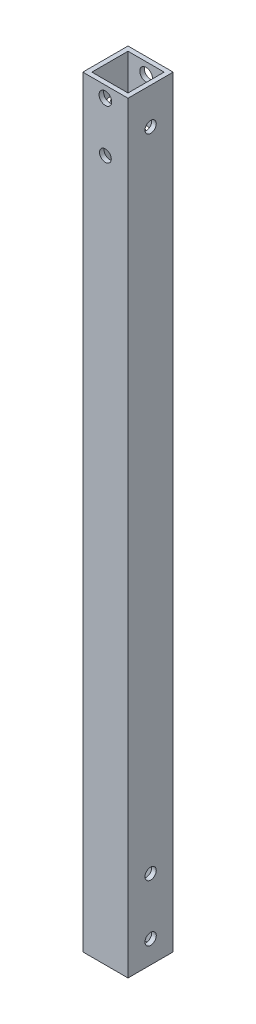
ISO-10303-21;
HEADER;
FILE_DESCRIPTION(('STEP AP214'),'2;1');
FILE_NAME('part.step','',(''),(''),'','','');
FILE_SCHEMA(('AUTOMOTIVE_DESIGN { 1 0 10303 214 1 1 1 1 }'));
ENDSEC;
DATA;
#1=APPLICATION_CONTEXT('core data for automotive mechanical design processes');
#2=APPLICATION_PROTOCOL_DEFINITION('international standard','automotive_design',2000,#1);
#3=PRODUCT_CONTEXT('',#1,'mechanical');
#4=PRODUCT('Part','Part','',(#3));
#5=PRODUCT_RELATED_PRODUCT_CATEGORY('part','',(#4));
#6=PRODUCT_DEFINITION_FORMATION('','',#4);
#7=PRODUCT_DEFINITION_CONTEXT('part definition',#1,'design');
#8=PRODUCT_DEFINITION('design','',#6,#7);
#9=PRODUCT_DEFINITION_SHAPE('','',#8);
#10=(LENGTH_UNIT() NAMED_UNIT(*) SI_UNIT(.MILLI.,.METRE.));
#11=(NAMED_UNIT(*) PLANE_ANGLE_UNIT() SI_UNIT($,.RADIAN.));
#12=(NAMED_UNIT(*) SI_UNIT($,.STERADIAN.) SOLID_ANGLE_UNIT());
#13=UNCERTAINTY_MEASURE_WITH_UNIT(LENGTH_MEASURE(1.E-05),#10,'distance_accuracy_value','');
#14=(GEOMETRIC_REPRESENTATION_CONTEXT(3) GLOBAL_UNCERTAINTY_ASSIGNED_CONTEXT((#13)) GLOBAL_UNIT_ASSIGNED_CONTEXT((#10,
#11,#12)) REPRESENTATION_CONTEXT('',''));
#15=CARTESIAN_POINT('',(0.,0.,0.));
#16=DIRECTION('',(0.,0.,1.));
#17=DIRECTION('',(1.,0.,0.));
#18=AXIS2_PLACEMENT_3D('',#15,#16,#17);
#19=CARTESIAN_POINT('',(0.,337.,0.));
#20=DIRECTION('',(0.,1.,0.));
#21=DIRECTION('',(0.,0.,1.));
#22=AXIS2_PLACEMENT_3D('',#19,#20,#21);
#23=PLANE('',#22);
#24=DIRECTION('',(0.,0.,1.));
#25=VECTOR('',#24,1.);
#26=CARTESIAN_POINT('',(0.,337.,0.));
#27=LINE('',#26,#25);
#28=CARTESIAN_POINT('',(0.,337.,-20.));
#29=VERTEX_POINT('',#28);
#30=CARTESIAN_POINT('',(0.,337.,0.));
#31=VERTEX_POINT('',#30);
#32=EDGE_CURVE('E164',#29,#31,#27,.T.);
#33=ORIENTED_EDGE('',*,*,#32,.T.);
#34=DIRECTION('',(1.,0.,0.));
#35=VECTOR('',#34,1.);
#36=CARTESIAN_POINT('',(0.,337.,0.));
#37=LINE('',#36,#35);
#38=CARTESIAN_POINT('',(20.,337.,0.));
#39=VERTEX_POINT('',#38);
#40=EDGE_CURVE('E167',#31,#39,#37,.T.);
#41=ORIENTED_EDGE('',*,*,#40,.T.);
#42=DIRECTION('',(0.,0.,-1.));
#43=VECTOR('',#42,1.);
#44=CARTESIAN_POINT('',(20.,337.,0.));
#45=LINE('',#44,#43);
#46=CARTESIAN_POINT('',(20.,337.,-20.));
#47=VERTEX_POINT('',#46);
#48=EDGE_CURVE('E170',#39,#47,#45,.T.);
#49=ORIENTED_EDGE('',*,*,#48,.T.);
#50=DIRECTION('',(-1.,0.,0.));
#51=VECTOR('',#50,1.);
#52=CARTESIAN_POINT('',(0.,337.,-20.));
#53=LINE('',#52,#51);
#54=EDGE_CURVE('E172',#47,#29,#53,.T.);
#55=ORIENTED_EDGE('',*,*,#54,.T.);
#56=EDGE_LOOP('',(#33,#41,#49,#55));
#57=FACE_BOUND('',#56,.T.);
#58=DIRECTION('',(1.,0.,0.));
#59=VECTOR('',#58,1.);
#60=CARTESIAN_POINT('',(0.,337.,-2.));
#61=LINE('',#60,#59);
#62=CARTESIAN_POINT('',(2.,337.,-2.));
#63=VERTEX_POINT('',#62);
#64=CARTESIAN_POINT('',(18.,337.,-2.));
#65=VERTEX_POINT('',#64);
#66=EDGE_CURVE('E134',#63,#65,#61,.T.);
#67=ORIENTED_EDGE('',*,*,#66,.F.);
#68=DIRECTION('',(0.,0.,1.));
#69=VECTOR('',#68,1.);
#70=CARTESIAN_POINT('',(2.,337.,0.));
#71=LINE('',#70,#69);
#72=CARTESIAN_POINT('',(2.,337.,-18.));
#73=VERTEX_POINT('',#72);
#74=EDGE_CURVE('E126',#73,#63,#71,.T.);
#75=ORIENTED_EDGE('',*,*,#74,.F.);
#76=DIRECTION('',(-1.,0.,0.));
#77=VECTOR('',#76,1.);
#78=CARTESIAN_POINT('',(0.,337.,-18.));
#79=LINE('',#78,#77);
#80=CARTESIAN_POINT('',(18.,337.,-18.));
#81=VERTEX_POINT('',#80);
#82=EDGE_CURVE('E148',#81,#73,#79,.T.);
#83=ORIENTED_EDGE('',*,*,#82,.F.);
#84=DIRECTION('',(0.,0.,-1.));
#85=VECTOR('',#84,1.);
#86=CARTESIAN_POINT('',(18.,337.,0.));
#87=LINE('',#86,#85);
#88=EDGE_CURVE('E146',#65,#81,#87,.T.);
#89=ORIENTED_EDGE('',*,*,#88,.F.);
#90=EDGE_LOOP('',(#67,#75,#83,#89));
#91=FACE_BOUND('',#90,.T.);
#92=ADVANCED_FACE('F59',(#57,#91),#23,.T.);
#93=CARTESIAN_POINT('',(0.,0.,0.));
#94=DIRECTION('',(0.,1.,0.));
#95=DIRECTION('',(0.,0.,1.));
#96=AXIS2_PLACEMENT_3D('',#93,#94,#95);
#97=PLANE('',#96);
#98=DIRECTION('',(0.,0.,1.));
#99=VECTOR('',#98,1.);
#100=CARTESIAN_POINT('',(0.,0.,0.));
#101=LINE('',#100,#99);
#102=CARTESIAN_POINT('',(0.,0.,-20.));
#103=VERTEX_POINT('',#102);
#104=CARTESIAN_POINT('',(0.,0.,0.));
#105=VERTEX_POINT('',#104);
#106=EDGE_CURVE('E142',#103,#105,#101,.T.);
#107=ORIENTED_EDGE('',*,*,#106,.F.);
#108=DIRECTION('',(-1.,0.,0.));
#109=VECTOR('',#108,1.);
#110=CARTESIAN_POINT('',(0.,0.,-20.));
#111=LINE('',#110,#109);
#112=CARTESIAN_POINT('',(20.,0.,-20.));
#113=VERTEX_POINT('',#112);
#114=EDGE_CURVE('E168',#113,#103,#111,.T.);
#115=ORIENTED_EDGE('',*,*,#114,.F.);
#116=DIRECTION('',(0.,0.,-1.));
#117=VECTOR('',#116,1.);
#118=CARTESIAN_POINT('',(20.,0.,0.));
#119=LINE('',#118,#117);
#120=CARTESIAN_POINT('',(20.,0.,0.));
#121=VERTEX_POINT('',#120);
#122=EDGE_CURVE('E179',#121,#113,#119,.T.);
#123=ORIENTED_EDGE('',*,*,#122,.F.);
#124=DIRECTION('',(1.,0.,0.));
#125=VECTOR('',#124,1.);
#126=CARTESIAN_POINT('',(0.,0.,0.));
#127=LINE('',#126,#125);
#128=EDGE_CURVE('E177',#105,#121,#127,.T.);
#129=ORIENTED_EDGE('',*,*,#128,.F.);
#130=EDGE_LOOP('',(#107,#115,#123,#129));
#131=FACE_BOUND('',#130,.T.);
#132=DIRECTION('',(0.,0.,1.));
#133=VECTOR('',#132,1.);
#134=CARTESIAN_POINT('',(2.,0.,0.));
#135=LINE('',#134,#133);
#136=CARTESIAN_POINT('',(2.,0.,-18.));
#137=VERTEX_POINT('',#136);
#138=CARTESIAN_POINT('',(2.,0.,-2.));
#139=VERTEX_POINT('',#138);
#140=EDGE_CURVE('E84',#137,#139,#135,.T.);
#141=ORIENTED_EDGE('',*,*,#140,.T.);
#142=DIRECTION('',(1.,0.,0.));
#143=VECTOR('',#142,1.);
#144=CARTESIAN_POINT('',(0.,0.,-2.));
#145=LINE('',#144,#143);
#146=CARTESIAN_POINT('',(18.,0.,-2.));
#147=VERTEX_POINT('',#146);
#148=EDGE_CURVE('E141',#139,#147,#145,.T.);
#149=ORIENTED_EDGE('',*,*,#148,.T.);
#150=DIRECTION('',(0.,0.,-1.));
#151=VECTOR('',#150,1.);
#152=CARTESIAN_POINT('',(18.,0.,0.));
#153=LINE('',#152,#151);
#154=CARTESIAN_POINT('',(18.,0.,-18.));
#155=VERTEX_POINT('',#154);
#156=EDGE_CURVE('E156',#147,#155,#153,.T.);
#157=ORIENTED_EDGE('',*,*,#156,.T.);
#158=DIRECTION('',(-1.,0.,0.));
#159=VECTOR('',#158,1.);
#160=CARTESIAN_POINT('',(0.,0.,-18.));
#161=LINE('',#160,#159);
#162=EDGE_CURVE('E135',#155,#137,#161,.T.);
#163=ORIENTED_EDGE('',*,*,#162,.T.);
#164=EDGE_LOOP('',(#141,#149,#157,#163));
#165=FACE_BOUND('',#164,.T.);
#166=ADVANCED_FACE('F252',(#131,#165),#97,.F.);
#167=CARTESIAN_POINT('',(0.,337.,0.));
#168=DIRECTION('',(1.,0.,0.));
#169=DIRECTION('',(0.,0.,-1.));
#170=AXIS2_PLACEMENT_3D('',#167,#168,#169);
#171=PLANE('',#170);
#172=CARTESIAN_POINT('',(0.,321.,-10.));
#173=DIRECTION('',(1.,0.,0.));
#174=DIRECTION('',(0.,0.,-1.));
#175=AXIS2_PLACEMENT_3D('',#172,#173,#174);
#176=CIRCLE('',#175,2.5);
#177=CARTESIAN_POINT('',(0.,321.,-12.5));
#178=VERTEX_POINT('',#177);
#179=EDGE_CURVE('E330',#178,#178,#176,.T.);
#180=ORIENTED_EDGE('',*,*,#179,.T.);
#181=EDGE_LOOP('',(#180));
#182=FACE_BOUND('',#181,.T.);
#183=CARTESIAN_POINT('',(0.,34.9999999999969,-10.0000000000083));
#184=DIRECTION('',(-1.,0.,0.));
#185=DIRECTION('',(0.,0.,1.));
#186=AXIS2_PLACEMENT_3D('',#183,#184,#185);
#187=CIRCLE('',#186,2.5);
#188=CARTESIAN_POINT('',(0.,34.9999999999969,-7.50000000000833));
#189=VERTEX_POINT('',#188);
#190=EDGE_CURVE('E219',#189,#189,#187,.T.);
#191=ORIENTED_EDGE('',*,*,#190,.F.);
#192=EDGE_LOOP('',(#191));
#193=FACE_BOUND('',#192,.T.);
#194=CARTESIAN_POINT('',(0.,10.,-10.0000000000083));
#195=DIRECTION('',(-1.,0.,0.));
#196=DIRECTION('',(0.,0.,1.));
#197=AXIS2_PLACEMENT_3D('',#194,#195,#196);
#198=CIRCLE('',#197,2.5);
#199=CARTESIAN_POINT('',(0.,10.,-7.50000000000833));
#200=VERTEX_POINT('',#199);
#201=EDGE_CURVE('E207',#200,#200,#198,.T.);
#202=ORIENTED_EDGE('',*,*,#201,.F.);
#203=EDGE_LOOP('',(#202));
#204=FACE_BOUND('',#203,.T.);
#205=ORIENTED_EDGE('',*,*,#106,.T.);
#206=DIRECTION('',(0.,-1.,0.));
#207=VECTOR('',#206,1.);
#208=CARTESIAN_POINT('',(0.,337.,0.));
#209=LINE('',#208,#207);
#210=EDGE_CURVE('E12',#31,#105,#209,.T.);
#211=ORIENTED_EDGE('',*,*,#210,.F.);
#212=ORIENTED_EDGE('',*,*,#32,.F.);
#213=DIRECTION('',(0.,-1.,0.));
#214=VECTOR('',#213,1.);
#215=CARTESIAN_POINT('',(0.,337.,-20.));
#216=LINE('',#215,#214);
#217=EDGE_CURVE('E174',#29,#103,#216,.T.);
#218=ORIENTED_EDGE('',*,*,#217,.T.);
#219=EDGE_LOOP('',(#205,#211,#212,#218));
#220=FACE_BOUND('',#219,.T.);
#221=ADVANCED_FACE('F61',(#182,#193,#204,#220),#171,.F.);
#222=CARTESIAN_POINT('',(0.,337.,0.));
#223=DIRECTION('',(0.,0.,-1.));
#224=DIRECTION('',(-1.,0.,0.));
#225=AXIS2_PLACEMENT_3D('',#222,#223,#224);
#226=PLANE('',#225);
#227=CARTESIAN_POINT('',(9.99999999999981,310.,0.));
#228=DIRECTION('',(0.,0.,-1.));
#229=DIRECTION('',(-1.,0.,0.));
#230=AXIS2_PLACEMENT_3D('',#227,#228,#229);
#231=CIRCLE('',#230,2.6);
#232=CARTESIAN_POINT('',(7.39999999999981,310.,0.));
#233=VERTEX_POINT('',#232);
#234=EDGE_CURVE('E200',#233,#233,#231,.T.);
#235=ORIENTED_EDGE('',*,*,#234,.T.);
#236=EDGE_LOOP('',(#235));
#237=FACE_BOUND('',#236,.T.);
#238=CARTESIAN_POINT('',(9.99999999999982,332.,0.));
#239=DIRECTION('',(0.,0.,-1.));
#240=DIRECTION('',(-1.,0.,0.));
#241=AXIS2_PLACEMENT_3D('',#238,#239,#240);
#242=CIRCLE('',#241,2.8);
#243=CARTESIAN_POINT('',(7.19999999999981,332.,0.));
#244=VERTEX_POINT('',#243);
#245=EDGE_CURVE('E342',#244,#244,#242,.T.);
#246=ORIENTED_EDGE('',*,*,#245,.T.);
#247=EDGE_LOOP('',(#246));
#248=FACE_BOUND('',#247,.T.);
#249=ORIENTED_EDGE('',*,*,#128,.T.);
#250=DIRECTION('',(0.,-1.,0.));
#251=VECTOR('',#250,1.);
#252=CARTESIAN_POINT('',(20.,337.,0.));
#253=LINE('',#252,#251);
#254=EDGE_CURVE('E68',#39,#121,#253,.T.);
#255=ORIENTED_EDGE('',*,*,#254,.F.);
#256=ORIENTED_EDGE('',*,*,#40,.F.);
#257=ORIENTED_EDGE('',*,*,#210,.T.);
#258=EDGE_LOOP('',(#249,#255,#256,#257));
#259=FACE_BOUND('',#258,.T.);
#260=ADVANCED_FACE('F251',(#237,#248,#259),#226,.F.);
#261=CARTESIAN_POINT('',(20.,337.,0.));
#262=DIRECTION('',(-1.,0.,0.));
#263=DIRECTION('',(0.,0.,1.));
#264=AXIS2_PLACEMENT_3D('',#261,#262,#263);
#265=PLANE('',#264);
#266=CARTESIAN_POINT('',(20.,321.,-10.));
#267=DIRECTION('',(1.,0.,0.));
#268=DIRECTION('',(0.,0.,-1.));
#269=AXIS2_PLACEMENT_3D('',#266,#267,#268);
#270=CIRCLE('',#269,2.5);
#271=CARTESIAN_POINT('',(20.,321.,-12.5));
#272=VERTEX_POINT('',#271);
#273=EDGE_CURVE('E329',#272,#272,#270,.T.);
#274=ORIENTED_EDGE('',*,*,#273,.F.);
#275=EDGE_LOOP('',(#274));
#276=FACE_BOUND('',#275,.T.);
#277=CARTESIAN_POINT('',(20.,34.9999999999969,-10.0000000000083));
#278=DIRECTION('',(-1.,0.,0.));
#279=DIRECTION('',(0.,0.,1.));
#280=AXIS2_PLACEMENT_3D('',#277,#278,#279);
#281=CIRCLE('',#280,2.5);
#282=CARTESIAN_POINT('',(20.,34.9999999999969,-7.50000000000833));
#283=VERTEX_POINT('',#282);
#284=EDGE_CURVE('E193',#283,#283,#281,.T.);
#285=ORIENTED_EDGE('',*,*,#284,.T.);
#286=EDGE_LOOP('',(#285));
#287=FACE_BOUND('',#286,.T.);
#288=CARTESIAN_POINT('',(20.,10.,-10.0000000000083));
#289=DIRECTION('',(-1.,0.,0.));
#290=DIRECTION('',(0.,0.,1.));
#291=AXIS2_PLACEMENT_3D('',#288,#289,#290);
#292=CIRCLE('',#291,2.5);
#293=CARTESIAN_POINT('',(20.,10.,-7.50000000000833));
#294=VERTEX_POINT('',#293);
#295=EDGE_CURVE('E222',#294,#294,#292,.T.);
#296=ORIENTED_EDGE('',*,*,#295,.T.);
#297=EDGE_LOOP('',(#296));
#298=FACE_BOUND('',#297,.T.);
#299=ORIENTED_EDGE('',*,*,#122,.T.);
#300=DIRECTION('',(0.,-1.,0.));
#301=VECTOR('',#300,1.);
#302=CARTESIAN_POINT('',(20.,337.,-20.));
#303=LINE('',#302,#301);
#304=EDGE_CURVE('E184',#47,#113,#303,.T.);
#305=ORIENTED_EDGE('',*,*,#304,.F.);
#306=ORIENTED_EDGE('',*,*,#48,.F.);
#307=ORIENTED_EDGE('',*,*,#254,.T.);
#308=EDGE_LOOP('',(#299,#305,#306,#307));
#309=FACE_BOUND('',#308,.T.);
#310=ADVANCED_FACE('F270',(#276,#287,#298,#309),#265,.F.);
#311=CARTESIAN_POINT('',(0.,337.,-20.));
#312=DIRECTION('',(0.,0.,1.));
#313=DIRECTION('',(1.,0.,0.));
#314=AXIS2_PLACEMENT_3D('',#311,#312,#313);
#315=PLANE('',#314);
#316=CARTESIAN_POINT('',(9.99999999999981,310.,-20.));
#317=DIRECTION('',(0.,0.,-1.));
#318=DIRECTION('',(-1.,0.,0.));
#319=AXIS2_PLACEMENT_3D('',#316,#317,#318);
#320=CIRCLE('',#319,2.6);
#321=CARTESIAN_POINT('',(7.39999999999981,310.,-20.));
#322=VERTEX_POINT('',#321);
#323=EDGE_CURVE('E340',#322,#322,#320,.T.);
#324=ORIENTED_EDGE('',*,*,#323,.F.);
#325=EDGE_LOOP('',(#324));
#326=FACE_BOUND('',#325,.T.);
#327=CARTESIAN_POINT('',(9.99999999999982,332.,-20.));
#328=DIRECTION('',(0.,0.,-1.));
#329=DIRECTION('',(-1.,0.,0.));
#330=AXIS2_PLACEMENT_3D('',#327,#328,#329);
#331=CIRCLE('',#330,2.8);
#332=CARTESIAN_POINT('',(7.19999999999981,332.,-20.));
#333=VERTEX_POINT('',#332);
#334=EDGE_CURVE('E214',#333,#333,#331,.T.);
#335=ORIENTED_EDGE('',*,*,#334,.F.);
#336=EDGE_LOOP('',(#335));
#337=FACE_BOUND('',#336,.T.);
#338=ORIENTED_EDGE('',*,*,#114,.T.);
#339=ORIENTED_EDGE('',*,*,#217,.F.);
#340=ORIENTED_EDGE('',*,*,#54,.F.);
#341=ORIENTED_EDGE('',*,*,#304,.T.);
#342=EDGE_LOOP('',(#338,#339,#340,#341));
#343=FACE_BOUND('',#342,.T.);
#344=ADVANCED_FACE('F236',(#326,#337,#343),#315,.F.);
#345=CARTESIAN_POINT('',(2.,337.,0.));
#346=DIRECTION('',(1.,0.,0.));
#347=DIRECTION('',(0.,0.,-1.));
#348=AXIS2_PLACEMENT_3D('',#345,#346,#347);
#349=PLANE('',#348);
#350=CARTESIAN_POINT('',(2.,321.,-10.));
#351=DIRECTION('',(1.,0.,0.));
#352=DIRECTION('',(0.,0.,-1.));
#353=AXIS2_PLACEMENT_3D('',#350,#351,#352);
#354=CIRCLE('',#353,2.5);
#355=CARTESIAN_POINT('',(2.,321.,-12.5));
#356=VERTEX_POINT('',#355);
#357=EDGE_CURVE('E335',#356,#356,#354,.T.);
#358=ORIENTED_EDGE('',*,*,#357,.F.);
#359=EDGE_LOOP('',(#358));
#360=FACE_BOUND('',#359,.T.);
#361=CARTESIAN_POINT('',(2.,34.9999999999969,-10.0000000000083));
#362=DIRECTION('',(1.,0.,0.));
#363=DIRECTION('',(0.,0.,-1.));
#364=AXIS2_PLACEMENT_3D('',#361,#362,#363);
#365=CIRCLE('',#364,2.5);
#366=CARTESIAN_POINT('',(2.,34.9999999999969,-12.5000000000083));
#367=VERTEX_POINT('',#366);
#368=EDGE_CURVE('E154',#367,#367,#365,.T.);
#369=ORIENTED_EDGE('',*,*,#368,.F.);
#370=EDGE_LOOP('',(#369));
#371=FACE_BOUND('',#370,.T.);
#372=CARTESIAN_POINT('',(2.,10.,-10.0000000000083));
#373=DIRECTION('',(1.,0.,0.));
#374=DIRECTION('',(0.,0.,-1.));
#375=AXIS2_PLACEMENT_3D('',#372,#373,#374);
#376=CIRCLE('',#375,2.5);
#377=CARTESIAN_POINT('',(2.,10.,-12.5000000000083));
#378=VERTEX_POINT('',#377);
#379=EDGE_CURVE('E192',#378,#378,#376,.T.);
#380=ORIENTED_EDGE('',*,*,#379,.F.);
#381=EDGE_LOOP('',(#380));
#382=FACE_BOUND('',#381,.T.);
#383=ORIENTED_EDGE('',*,*,#140,.F.);
#384=DIRECTION('',(0.,-1.,0.));
#385=VECTOR('',#384,1.);
#386=CARTESIAN_POINT('',(2.,337.,-18.));
#387=LINE('',#386,#385);
#388=EDGE_CURVE('E130',#73,#137,#387,.T.);
#389=ORIENTED_EDGE('',*,*,#388,.F.);
#390=ORIENTED_EDGE('',*,*,#74,.T.);
#391=DIRECTION('',(0.,-1.,0.));
#392=VECTOR('',#391,1.);
#393=CARTESIAN_POINT('',(2.,337.,-2.));
#394=LINE('',#393,#392);
#395=EDGE_CURVE('E129',#63,#139,#394,.T.);
#396=ORIENTED_EDGE('',*,*,#395,.T.);
#397=EDGE_LOOP('',(#383,#389,#390,#396));
#398=FACE_BOUND('',#397,.T.);
#399=ADVANCED_FACE('F128',(#360,#371,#382,#398),#349,.T.);
#400=CARTESIAN_POINT('',(0.,337.,-2.));
#401=DIRECTION('',(0.,0.,-1.));
#402=DIRECTION('',(-1.,0.,0.));
#403=AXIS2_PLACEMENT_3D('',#400,#401,#402);
#404=PLANE('',#403);
#405=CARTESIAN_POINT('',(9.99999999999981,310.,-2.));
#406=DIRECTION('',(0.,0.,-1.));
#407=DIRECTION('',(-1.,0.,0.));
#408=AXIS2_PLACEMENT_3D('',#405,#406,#407);
#409=CIRCLE('',#408,2.6);
#410=CARTESIAN_POINT('',(7.39999999999981,310.,-2.));
#411=VERTEX_POINT('',#410);
#412=EDGE_CURVE('E203',#411,#411,#409,.T.);
#413=ORIENTED_EDGE('',*,*,#412,.F.);
#414=EDGE_LOOP('',(#413));
#415=FACE_BOUND('',#414,.T.);
#416=CARTESIAN_POINT('',(9.99999999999982,332.,-2.));
#417=DIRECTION('',(0.,0.,-1.));
#418=DIRECTION('',(-1.,0.,0.));
#419=AXIS2_PLACEMENT_3D('',#416,#417,#418);
#420=CIRCLE('',#419,2.8);
#421=CARTESIAN_POINT('',(7.19999999999981,332.,-2.));
#422=VERTEX_POINT('',#421);
#423=EDGE_CURVE('E199',#422,#422,#420,.T.);
#424=ORIENTED_EDGE('',*,*,#423,.F.);
#425=EDGE_LOOP('',(#424));
#426=FACE_BOUND('',#425,.T.);
#427=ORIENTED_EDGE('',*,*,#148,.F.);
#428=ORIENTED_EDGE('',*,*,#395,.F.);
#429=ORIENTED_EDGE('',*,*,#66,.T.);
#430=DIRECTION('',(0.,-1.,0.));
#431=VECTOR('',#430,1.);
#432=CARTESIAN_POINT('',(18.,337.,-2.));
#433=LINE('',#432,#431);
#434=EDGE_CURVE('E143',#65,#147,#433,.T.);
#435=ORIENTED_EDGE('',*,*,#434,.T.);
#436=EDGE_LOOP('',(#427,#428,#429,#435));
#437=FACE_BOUND('',#436,.T.);
#438=ADVANCED_FACE('F138',(#415,#426,#437),#404,.T.);
#439=CARTESIAN_POINT('',(18.,337.,0.));
#440=DIRECTION('',(-1.,0.,0.));
#441=DIRECTION('',(0.,0.,1.));
#442=AXIS2_PLACEMENT_3D('',#439,#440,#441);
#443=PLANE('',#442);
#444=CARTESIAN_POINT('',(18.,321.,-10.));
#445=DIRECTION('',(-1.,0.,0.));
#446=DIRECTION('',(0.,0.,1.));
#447=AXIS2_PLACEMENT_3D('',#444,#445,#446);
#448=CIRCLE('',#447,2.5);
#449=CARTESIAN_POINT('',(18.,321.,-7.5));
#450=VERTEX_POINT('',#449);
#451=EDGE_CURVE('E63',#450,#450,#448,.T.);
#452=ORIENTED_EDGE('',*,*,#451,.F.);
#453=EDGE_LOOP('',(#452));
#454=FACE_BOUND('',#453,.T.);
#455=CARTESIAN_POINT('',(18.,34.9999999999969,-10.0000000000083));
#456=DIRECTION('',(-1.,0.,0.));
#457=DIRECTION('',(0.,0.,1.));
#458=AXIS2_PLACEMENT_3D('',#455,#456,#457);
#459=CIRCLE('',#458,2.5);
#460=CARTESIAN_POINT('',(18.,34.9999999999969,-7.50000000000833));
#461=VERTEX_POINT('',#460);
#462=EDGE_CURVE('E194',#461,#461,#459,.T.);
#463=ORIENTED_EDGE('',*,*,#462,.F.);
#464=EDGE_LOOP('',(#463));
#465=FACE_BOUND('',#464,.T.);
#466=CARTESIAN_POINT('',(18.,10.,-10.0000000000083));
#467=DIRECTION('',(-1.,0.,0.));
#468=DIRECTION('',(0.,0.,1.));
#469=AXIS2_PLACEMENT_3D('',#466,#467,#468);
#470=CIRCLE('',#469,2.5);
#471=CARTESIAN_POINT('',(18.,10.,-7.50000000000833));
#472=VERTEX_POINT('',#471);
#473=EDGE_CURVE('E189',#472,#472,#470,.T.);
#474=ORIENTED_EDGE('',*,*,#473,.F.);
#475=EDGE_LOOP('',(#474));
#476=FACE_BOUND('',#475,.T.);
#477=ORIENTED_EDGE('',*,*,#156,.F.);
#478=ORIENTED_EDGE('',*,*,#434,.F.);
#479=ORIENTED_EDGE('',*,*,#88,.T.);
#480=DIRECTION('',(0.,-1.,0.));
#481=VECTOR('',#480,1.);
#482=CARTESIAN_POINT('',(18.,337.,-18.));
#483=LINE('',#482,#481);
#484=EDGE_CURVE('E76',#81,#155,#483,.T.);
#485=ORIENTED_EDGE('',*,*,#484,.T.);
#486=EDGE_LOOP('',(#477,#478,#479,#485));
#487=FACE_BOUND('',#486,.T.);
#488=ADVANCED_FACE('F292',(#454,#465,#476,#487),#443,.T.);
#489=CARTESIAN_POINT('',(0.,337.,-18.));
#490=DIRECTION('',(0.,0.,1.));
#491=DIRECTION('',(1.,0.,0.));
#492=AXIS2_PLACEMENT_3D('',#489,#490,#491);
#493=PLANE('',#492);
#494=CARTESIAN_POINT('',(9.99999999999981,310.,-18.));
#495=DIRECTION('',(0.,0.,1.));
#496=DIRECTION('',(1.,0.,0.));
#497=AXIS2_PLACEMENT_3D('',#494,#495,#496);
#498=CIRCLE('',#497,2.6);
#499=CARTESIAN_POINT('',(12.5999999999998,310.,-18.));
#500=VERTEX_POINT('',#499);
#501=EDGE_CURVE('E201',#500,#500,#498,.T.);
#502=ORIENTED_EDGE('',*,*,#501,.F.);
#503=EDGE_LOOP('',(#502));
#504=FACE_BOUND('',#503,.T.);
#505=CARTESIAN_POINT('',(9.99999999999982,332.,-18.));
#506=DIRECTION('',(0.,0.,1.));
#507=DIRECTION('',(1.,0.,0.));
#508=AXIS2_PLACEMENT_3D('',#505,#506,#507);
#509=CIRCLE('',#508,2.8);
#510=CARTESIAN_POINT('',(12.7999999999998,332.,-18.));
#511=VERTEX_POINT('',#510);
#512=EDGE_CURVE('E197',#511,#511,#509,.T.);
#513=ORIENTED_EDGE('',*,*,#512,.F.);
#514=EDGE_LOOP('',(#513));
#515=FACE_BOUND('',#514,.T.);
#516=ORIENTED_EDGE('',*,*,#162,.F.);
#517=ORIENTED_EDGE('',*,*,#484,.F.);
#518=ORIENTED_EDGE('',*,*,#82,.T.);
#519=ORIENTED_EDGE('',*,*,#388,.T.);
#520=EDGE_LOOP('',(#516,#517,#518,#519));
#521=FACE_BOUND('',#520,.T.);
#522=ADVANCED_FACE('F296',(#504,#515,#521),#493,.T.);
#523=CARTESIAN_POINT('',(20.,10.,-10.0000000000083));
#524=DIRECTION('',(-1.,0.,0.));
#525=DIRECTION('',(0.,0.,1.));
#526=AXIS2_PLACEMENT_3D('',#523,#524,#525);
#527=CYLINDRICAL_SURFACE('',#526,2.5);
#528=ORIENTED_EDGE('',*,*,#473,.T.);
#529=EDGE_LOOP('',(#528));
#530=FACE_BOUND('',#529,.T.);
#531=ORIENTED_EDGE('',*,*,#295,.F.);
#532=EDGE_LOOP('',(#531));
#533=FACE_BOUND('',#532,.T.);
#534=ADVANCED_FACE('F246',(#530,#533),#527,.F.);
#535=CARTESIAN_POINT('',(20.,34.9999999999969,-10.0000000000083));
#536=DIRECTION('',(-1.,0.,0.));
#537=DIRECTION('',(0.,0.,1.));
#538=AXIS2_PLACEMENT_3D('',#535,#536,#537);
#539=CYLINDRICAL_SURFACE('',#538,2.5);
#540=ORIENTED_EDGE('',*,*,#462,.T.);
#541=EDGE_LOOP('',(#540));
#542=FACE_BOUND('',#541,.T.);
#543=ORIENTED_EDGE('',*,*,#284,.F.);
#544=EDGE_LOOP('',(#543));
#545=FACE_BOUND('',#544,.T.);
#546=ADVANCED_FACE('F244',(#542,#545),#539,.F.);
#547=ORIENTED_EDGE('',*,*,#379,.T.);
#548=EDGE_LOOP('',(#547));
#549=FACE_BOUND('',#548,.T.);
#550=ORIENTED_EDGE('',*,*,#201,.T.);
#551=EDGE_LOOP('',(#550));
#552=FACE_BOUND('',#551,.T.);
#553=ADVANCED_FACE('F241',(#549,#552),#527,.F.);
#554=ORIENTED_EDGE('',*,*,#368,.T.);
#555=EDGE_LOOP('',(#554));
#556=FACE_BOUND('',#555,.T.);
#557=ORIENTED_EDGE('',*,*,#190,.T.);
#558=EDGE_LOOP('',(#557));
#559=FACE_BOUND('',#558,.T.);
#560=ADVANCED_FACE('F231',(#556,#559),#539,.F.);
#561=CARTESIAN_POINT('',(9.99999999999982,332.,0.));
#562=DIRECTION('',(0.,0.,-1.));
#563=DIRECTION('',(-1.,0.,0.));
#564=AXIS2_PLACEMENT_3D('',#561,#562,#563);
#565=CYLINDRICAL_SURFACE('',#564,2.8);
#566=ORIENTED_EDGE('',*,*,#512,.T.);
#567=EDGE_LOOP('',(#566));
#568=FACE_BOUND('',#567,.T.);
#569=ORIENTED_EDGE('',*,*,#334,.T.);
#570=EDGE_LOOP('',(#569));
#571=FACE_BOUND('',#570,.T.);
#572=ADVANCED_FACE('F306',(#568,#571),#565,.F.);
#573=CARTESIAN_POINT('',(9.99999999999981,310.,0.));
#574=DIRECTION('',(0.,0.,-1.));
#575=DIRECTION('',(-1.,0.,0.));
#576=AXIS2_PLACEMENT_3D('',#573,#574,#575);
#577=CYLINDRICAL_SURFACE('',#576,2.6);
#578=ORIENTED_EDGE('',*,*,#501,.T.);
#579=EDGE_LOOP('',(#578));
#580=FACE_BOUND('',#579,.T.);
#581=ORIENTED_EDGE('',*,*,#323,.T.);
#582=EDGE_LOOP('',(#581));
#583=FACE_BOUND('',#582,.T.);
#584=ADVANCED_FACE('F309',(#580,#583),#577,.F.);
#585=ORIENTED_EDGE('',*,*,#423,.T.);
#586=EDGE_LOOP('',(#585));
#587=FACE_BOUND('',#586,.T.);
#588=ORIENTED_EDGE('',*,*,#245,.F.);
#589=EDGE_LOOP('',(#588));
#590=FACE_BOUND('',#589,.T.);
#591=ADVANCED_FACE('F311',(#587,#590),#565,.F.);
#592=ORIENTED_EDGE('',*,*,#412,.T.);
#593=EDGE_LOOP('',(#592));
#594=FACE_BOUND('',#593,.T.);
#595=ORIENTED_EDGE('',*,*,#234,.F.);
#596=EDGE_LOOP('',(#595));
#597=FACE_BOUND('',#596,.T.);
#598=ADVANCED_FACE('F314',(#594,#597),#577,.F.);
#599=CARTESIAN_POINT('',(0.,321.,-10.));
#600=DIRECTION('',(1.,0.,0.));
#601=DIRECTION('',(0.,0.,-1.));
#602=AXIS2_PLACEMENT_3D('',#599,#600,#601);
#603=CYLINDRICAL_SURFACE('',#602,2.5);
#604=ORIENTED_EDGE('',*,*,#451,.T.);
#605=EDGE_LOOP('',(#604));
#606=FACE_BOUND('',#605,.T.);
#607=ORIENTED_EDGE('',*,*,#273,.T.);
#608=EDGE_LOOP('',(#607));
#609=FACE_BOUND('',#608,.T.);
#610=ADVANCED_FACE('F315',(#606,#609),#603,.F.);
#611=ORIENTED_EDGE('',*,*,#357,.T.);
#612=EDGE_LOOP('',(#611));
#613=FACE_BOUND('',#612,.T.);
#614=ORIENTED_EDGE('',*,*,#179,.F.);
#615=EDGE_LOOP('',(#614));
#616=FACE_BOUND('',#615,.T.);
#617=ADVANCED_FACE('F317',(#613,#616),#603,.F.);
#618=CLOSED_SHELL('',(#92,#166,#221,#260,#310,#344,#399,#438,#488,#522,#534,#546,#553,#560,#572,
#584,#591,#598,#610,#617));
#619=MANIFOLD_SOLID_BREP('B2',#618);
#620=ADVANCED_BREP_SHAPE_REPRESENTATION('',(#18,#619),#14);
#621=SHAPE_DEFINITION_REPRESENTATION(#9,#620);
ENDSEC;
END-ISO-10303-21;
